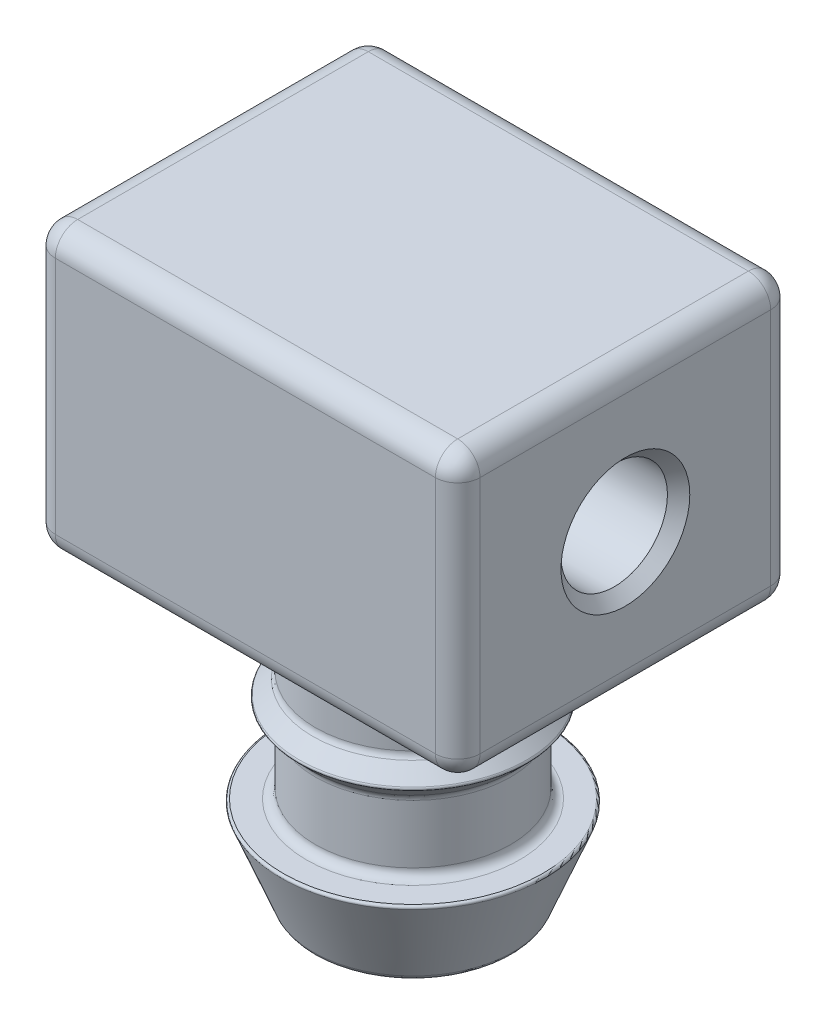
ISO-10303-21;
HEADER;
FILE_DESCRIPTION(('STEP AP214'),'2;1');
FILE_NAME('part.step','',(''),(''),'','','');
FILE_SCHEMA(('AUTOMOTIVE_DESIGN { 1 0 10303 214 1 1 1 1 }'));
ENDSEC;
DATA;
#1=APPLICATION_CONTEXT('core data for automotive mechanical design processes');
#2=APPLICATION_PROTOCOL_DEFINITION('international standard','automotive_design',2000,#1);
#3=PRODUCT_CONTEXT('',#1,'mechanical');
#4=PRODUCT('Part','Part','',(#3));
#5=PRODUCT_RELATED_PRODUCT_CATEGORY('part','',(#4));
#6=PRODUCT_DEFINITION_FORMATION('','',#4);
#7=PRODUCT_DEFINITION_CONTEXT('part definition',#1,'design');
#8=PRODUCT_DEFINITION('design','',#6,#7);
#9=PRODUCT_DEFINITION_SHAPE('','',#8);
#10=(LENGTH_UNIT() NAMED_UNIT(*) SI_UNIT(.MILLI.,.METRE.));
#11=(NAMED_UNIT(*) PLANE_ANGLE_UNIT() SI_UNIT($,.RADIAN.));
#12=(NAMED_UNIT(*) SI_UNIT($,.STERADIAN.) SOLID_ANGLE_UNIT());
#13=UNCERTAINTY_MEASURE_WITH_UNIT(LENGTH_MEASURE(1.E-05),#10,'distance_accuracy_value','');
#14=(GEOMETRIC_REPRESENTATION_CONTEXT(3) GLOBAL_UNCERTAINTY_ASSIGNED_CONTEXT((#13)) GLOBAL_UNIT_ASSIGNED_CONTEXT((#10,
#11,#12)) REPRESENTATION_CONTEXT('',''));
#15=CARTESIAN_POINT('',(0.,0.,0.));
#16=DIRECTION('',(0.,0.,1.));
#17=DIRECTION('',(1.,0.,0.));
#18=AXIS2_PLACEMENT_3D('',#15,#16,#17);
#19=CARTESIAN_POINT('',(0.,-4.7625,0.));
#20=DIRECTION('',(0.,1.,0.));
#21=DIRECTION('',(0.,0.,1.));
#22=AXIS2_PLACEMENT_3D('',#19,#20,#21);
#23=CONICAL_SURFACE('',#22,5.159375,0.785398163397442);
#24=CARTESIAN_POINT('',(0.,-4.83265825094585,0.));
#25=DIRECTION('',(0.,-1.,0.));
#26=DIRECTION('',(0.,0.,-1.));
#27=AXIS2_PLACEMENT_3D('',#24,#25,#26);
#28=CIRCLE('',#27,5.08921674905415);
#29=CARTESIAN_POINT('',(0.,-4.83265825094585,-5.08921674905415));
#30=VERTEX_POINT('',#29);
#31=EDGE_CURVE('E246',#30,#30,#28,.T.);
#32=ORIENTED_EDGE('',*,*,#31,.T.);
#33=EDGE_LOOP('',(#32));
#34=FACE_BOUND('',#33,.T.);
#35=CARTESIAN_POINT('',(0.,-5.44000800378342,0.));
#36=DIRECTION('',(0.,-1.,0.));
#37=DIRECTION('',(0.,0.,-1.));
#38=AXIS2_PLACEMENT_3D('',#35,#36,#37);
#39=CIRCLE('',#38,4.48186699621659);
#40=CARTESIAN_POINT('',(0.,-5.44000800378342,-4.48186699621659));
#41=VERTEX_POINT('',#40);
#42=EDGE_CURVE('E225',#41,#41,#39,.F.);
#43=ORIENTED_EDGE('',*,*,#42,.T.);
#44=EDGE_LOOP('',(#43));
#45=FACE_BOUND('',#44,.T.);
#46=ADVANCED_FACE('F36',(#34,#45),#23,.T.);
#47=CARTESIAN_POINT('',(0.,-3.96874999999999,0.));
#48=DIRECTION('',(0.,-1.,0.));
#49=DIRECTION('',(0.,0.,-1.));
#50=AXIS2_PLACEMENT_3D('',#47,#48,#49);
#51=CONICAL_SURFACE('',#50,4.365625,0.785398163397443);
#52=CARTESIAN_POINT('',(0.,-4.69234174905415,0.));
#53=DIRECTION('',(0.,1.,0.));
#54=DIRECTION('',(0.,0.,1.));
#55=AXIS2_PLACEMENT_3D('',#52,#53,#54);
#56=CIRCLE('',#55,5.08921674905415);
#57=CARTESIAN_POINT('',(0.,-4.69234174905415,5.08921674905415));
#58=VERTEX_POINT('',#57);
#59=EDGE_CURVE('E243',#58,#58,#56,.T.);
#60=ORIENTED_EDGE('',*,*,#59,.T.);
#61=EDGE_LOOP('',(#60));
#62=FACE_BOUND('',#61,.T.);
#63=CARTESIAN_POINT('',(0.,-4.08499199621658,0.));
#64=DIRECTION('',(0.,1.,0.));
#65=DIRECTION('',(0.,0.,1.));
#66=AXIS2_PLACEMENT_3D('',#63,#64,#65);
#67=CIRCLE('',#66,4.48186699621659);
#68=CARTESIAN_POINT('',(0.,-4.08499199621658,4.48186699621659));
#69=VERTEX_POINT('',#68);
#70=EDGE_CURVE('E222',#69,#69,#67,.F.);
#71=ORIENTED_EDGE('',*,*,#70,.T.);
#72=EDGE_LOOP('',(#71));
#73=FACE_BOUND('',#72,.T.);
#74=ADVANCED_FACE('F403',(#62,#73),#51,.T.);
#75=CARTESIAN_POINT('',(0.,7.73770022883319,0.));
#76=DIRECTION('',(0.,1.,0.));
#77=DIRECTION('',(0.,0.,1.));
#78=AXIS2_PLACEMENT_3D('',#75,#76,#77);
#79=CYLINDRICAL_SURFACE('',#78,4.365625);
#80=CARTESIAN_POINT('',(0.,-5.72064100756683,0.));
#81=DIRECTION('',(0.,1.,0.));
#82=DIRECTION('',(0.,0.,1.));
#83=AXIS2_PLACEMENT_3D('',#80,#81,#82);
#84=CIRCLE('',#83,4.365625);
#85=CARTESIAN_POINT('',(0.,-5.72064100756683,4.365625));
#86=VERTEX_POINT('',#85);
#87=EDGE_CURVE('E231',#86,#86,#84,.F.);
#88=ORIENTED_EDGE('',*,*,#87,.T.);
#89=EDGE_LOOP('',(#88));
#90=FACE_BOUND('',#89,.T.);
#91=CARTESIAN_POINT('',(0.,-8.334375,0.));
#92=DIRECTION('',(0.,-1.,0.));
#93=DIRECTION('',(0.,0.,-1.));
#94=AXIS2_PLACEMENT_3D('',#91,#92,#93);
#95=CIRCLE('',#94,4.365625);
#96=CARTESIAN_POINT('',(0.,-8.334375,-4.365625));
#97=VERTEX_POINT('',#96);
#98=EDGE_CURVE('E228',#97,#97,#95,.F.);
#99=ORIENTED_EDGE('',*,*,#98,.T.);
#100=EDGE_LOOP('',(#99));
#101=FACE_BOUND('',#100,.T.);
#102=ADVANCED_FACE('F411',(#90,#101),#79,.T.);
#103=CARTESIAN_POINT('',(0.,-8.73125,0.));
#104=DIRECTION('',(0.,-1.,0.));
#105=DIRECTION('',(0.,0.,-1.));
#106=AXIS2_PLACEMENT_3D('',#103,#104,#105);
#107=PLANE('',#106);
#108=CARTESIAN_POINT('',(0.,-8.73125,0.));
#109=DIRECTION('',(0.,-1.,0.));
#110=DIRECTION('',(0.,0.,-1.));
#111=AXIS2_PLACEMENT_3D('',#108,#109,#110);
#112=CIRCLE('',#111,5.80657563585843);
#113=CARTESIAN_POINT('',(0.,-8.73125,-5.80657563585843));
#114=VERTEX_POINT('',#113);
#115=EDGE_CURVE('E249',#114,#114,#112,.F.);
#116=ORIENTED_EDGE('',*,*,#115,.T.);
#117=EDGE_LOOP('',(#116));
#118=FACE_BOUND('',#117,.T.);
#119=CARTESIAN_POINT('',(0.,-8.73125,0.));
#120=DIRECTION('',(0.,-1.,0.));
#121=DIRECTION('',(0.,0.,-1.));
#122=AXIS2_PLACEMENT_3D('',#119,#120,#121);
#123=CIRCLE('',#122,4.7625);
#124=CARTESIAN_POINT('',(0.,-8.73125,-4.7625));
#125=VERTEX_POINT('',#124);
#126=EDGE_CURVE('E240',#125,#125,#123,.T.);
#127=ORIENTED_EDGE('',*,*,#126,.T.);
#128=EDGE_LOOP('',(#127));
#129=FACE_BOUND('',#128,.T.);
#130=ADVANCED_FACE('F726',(#118,#129),#107,.F.);
#131=CARTESIAN_POINT('',(0.,-12.7,0.));
#132=DIRECTION('',(0.,1.,0.));
#133=DIRECTION('',(0.,0.,1.));
#134=AXIS2_PLACEMENT_3D('',#131,#132,#133);
#135=CONICAL_SURFACE('',#134,4.365625,0.380506377112365);
#136=CARTESIAN_POINT('',(0.,-8.86731766866951,0.));
#137=DIRECTION('',(0.,-1.,0.));
#138=DIRECTION('',(0.,0.,-1.));
#139=AXIS2_PLACEMENT_3D('',#136,#137,#138);
#140=CIRCLE('',#139,5.8986979325322);
#141=CARTESIAN_POINT('',(0.,-8.86731766866951,-5.8986979325322));
#142=VERTEX_POINT('',#141);
#143=EDGE_CURVE('E252',#142,#142,#140,.T.);
#144=ORIENTED_EDGE('',*,*,#143,.T.);
#145=EDGE_LOOP('',(#144));
#146=FACE_BOUND('',#145,.T.);
#147=CARTESIAN_POINT('',(0.,-12.450520674678,0.));
#148=DIRECTION('',(0.,-1.,0.));
#149=DIRECTION('',(0.,0.,-1.));
#150=AXIS2_PLACEMENT_3D('',#147,#148,#149);
#151=CIRCLE('',#150,4.46541673012879);
#152=CARTESIAN_POINT('',(0.,-12.450520674678,-4.46541673012879));
#153=VERTEX_POINT('',#152);
#154=EDGE_CURVE('E234',#153,#153,#151,.F.);
#155=ORIENTED_EDGE('',*,*,#154,.T.);
#156=EDGE_LOOP('',(#155));
#157=FACE_BOUND('',#156,.T.);
#158=ADVANCED_FACE('F404',(#146,#157),#135,.T.);
#159=CARTESIAN_POINT('',(0.,-12.7,0.));
#160=DIRECTION('',(0.,1.,0.));
#161=DIRECTION('',(0.,0.,1.));
#162=AXIS2_PLACEMENT_3D('',#159,#160,#161);
#163=PLANE('',#162);
#164=CARTESIAN_POINT('',(0.,-12.7,0.));
#165=DIRECTION('',(0.,1.,0.));
#166=DIRECTION('',(0.,0.,1.));
#167=AXIS2_PLACEMENT_3D('',#164,#165,#166);
#168=CIRCLE('',#167,4.0969275434337);
#169=CARTESIAN_POINT('',(0.,-12.7,4.0969275434337));
#170=VERTEX_POINT('',#169);
#171=EDGE_CURVE('E237',#170,#170,#168,.F.);
#172=ORIENTED_EDGE('',*,*,#171,.T.);
#173=EDGE_LOOP('',(#172));
#174=FACE_BOUND('',#173,.T.);
#175=ADVANCED_FACE('F395',(#174),#163,.F.);
#176=CARTESIAN_POINT('',(0.,0.,0.));
#177=DIRECTION('',(0.,1.,0.));
#178=DIRECTION('',(0.,0.,1.));
#179=AXIS2_PLACEMENT_3D('',#176,#177,#178);
#180=PLANE('',#179);
#181=DIRECTION('',(0.,0.,1.));
#182=VECTOR('',#181,1.);
#183=CARTESIAN_POINT('',(-8.5,0.,-7.5));
#184=LINE('',#183,#182);
#185=CARTESIAN_POINT('',(-8.5,0.,6.5));
#186=VERTEX_POINT('',#185);
#187=CARTESIAN_POINT('',(-8.5,0.,-6.5));
#188=VERTEX_POINT('',#187);
#189=EDGE_CURVE('E59',#186,#188,#184,.F.);
#190=ORIENTED_EDGE('',*,*,#189,.T.);
#191=DIRECTION('',(-1.,0.,0.));
#192=VECTOR('',#191,1.);
#193=CARTESIAN_POINT('',(9.5,0.,-6.5));
#194=LINE('',#193,#192);
#195=CARTESIAN_POINT('',(8.5,0.,-6.5));
#196=VERTEX_POINT('',#195);
#197=EDGE_CURVE('E11',#188,#196,#194,.F.);
#198=ORIENTED_EDGE('',*,*,#197,.T.);
#199=DIRECTION('',(0.,0.,-1.));
#200=VECTOR('',#199,1.);
#201=CARTESIAN_POINT('',(8.5,0.,7.5));
#202=LINE('',#201,#200);
#203=CARTESIAN_POINT('',(8.5,0.,6.5));
#204=VERTEX_POINT('',#203);
#205=EDGE_CURVE('E45',#196,#204,#202,.F.);
#206=ORIENTED_EDGE('',*,*,#205,.T.);
#207=DIRECTION('',(1.,0.,0.));
#208=VECTOR('',#207,1.);
#209=CARTESIAN_POINT('',(-9.5,0.,6.5));
#210=LINE('',#209,#208);
#211=EDGE_CURVE('E302',#204,#186,#210,.F.);
#212=ORIENTED_EDGE('',*,*,#211,.T.);
#213=EDGE_LOOP('',(#190,#198,#206,#212));
#214=FACE_BOUND('',#213,.T.);
#215=CARTESIAN_POINT('',(0.,0.,0.));
#216=DIRECTION('',(0.,1.,0.));
#217=DIRECTION('',(0.,0.,1.));
#218=AXIS2_PLACEMENT_3D('',#215,#216,#217);
#219=CIRCLE('',#218,4.7625);
#220=CARTESIAN_POINT('',(0.,0.,4.7625));
#221=VERTEX_POINT('',#220);
#222=EDGE_CURVE('E206',#221,#221,#219,.T.);
#223=ORIENTED_EDGE('',*,*,#222,.T.);
#224=EDGE_LOOP('',(#223));
#225=FACE_BOUND('',#224,.T.);
#226=ADVANCED_FACE('F392',(#214,#225),#180,.F.);
#227=CARTESIAN_POINT('',(0.,7.73770022883319,0.));
#228=DIRECTION('',(0.,1.,0.));
#229=DIRECTION('',(0.,0.,1.));
#230=AXIS2_PLACEMENT_3D('',#227,#228,#229);
#231=CYLINDRICAL_SURFACE('',#230,4.365625);
#232=CARTESIAN_POINT('',(0.,-0.396875000000001,0.));
#233=DIRECTION('',(0.,1.,0.));
#234=DIRECTION('',(0.,0.,1.));
#235=AXIS2_PLACEMENT_3D('',#232,#233,#234);
#236=CIRCLE('',#235,4.365625);
#237=CARTESIAN_POINT('',(0.,-0.396875000000001,4.365625));
#238=VERTEX_POINT('',#237);
#239=EDGE_CURVE('E217',#238,#238,#236,.F.);
#240=ORIENTED_EDGE('',*,*,#239,.T.);
#241=EDGE_LOOP('',(#240));
#242=FACE_BOUND('',#241,.T.);
#243=CARTESIAN_POINT('',(0.,-3.80435899243317,0.));
#244=DIRECTION('',(0.,1.,0.));
#245=DIRECTION('',(0.,0.,1.));
#246=AXIS2_PLACEMENT_3D('',#243,#244,#245);
#247=CIRCLE('',#246,4.365625);
#248=CARTESIAN_POINT('',(0.,-3.80435899243317,4.365625));
#249=VERTEX_POINT('',#248);
#250=EDGE_CURVE('E212',#249,#249,#247,.T.);
#251=ORIENTED_EDGE('',*,*,#250,.T.);
#252=EDGE_LOOP('',(#251));
#253=FACE_BOUND('',#252,.T.);
#254=ADVANCED_FACE('F394',(#242,#253),#231,.T.);
#255=CARTESIAN_POINT('',(9.5,0.,7.5));
#256=DIRECTION('',(1.,0.,0.));
#257=DIRECTION('',(0.,0.,-1.));
#258=AXIS2_PLACEMENT_3D('',#255,#256,#257);
#259=PLANE('',#258);
#260=DIRECTION('',(0.,1.,0.));
#261=VECTOR('',#260,1.);
#262=CARTESIAN_POINT('',(9.5,0.,-6.5));
#263=LINE('',#262,#261);
#264=CARTESIAN_POINT('',(9.5,1.,-6.5));
#265=VERTEX_POINT('',#264);
#266=CARTESIAN_POINT('',(9.5,11.7,-6.5));
#267=VERTEX_POINT('',#266);
#268=EDGE_CURVE('E290',#265,#267,#263,.T.);
#269=ORIENTED_EDGE('',*,*,#268,.T.);
#270=DIRECTION('',(0.,0.,-1.));
#271=VECTOR('',#270,1.);
#272=CARTESIAN_POINT('',(9.5,11.7,7.5));
#273=LINE('',#272,#271);
#274=CARTESIAN_POINT('',(9.5,11.7,6.5));
#275=VERTEX_POINT('',#274);
#276=EDGE_CURVE('E160',#267,#275,#273,.F.);
#277=ORIENTED_EDGE('',*,*,#276,.T.);
#278=DIRECTION('',(0.,1.,0.));
#279=VECTOR('',#278,1.);
#280=CARTESIAN_POINT('',(9.5,0.,6.5));
#281=LINE('',#280,#279);
#282=CARTESIAN_POINT('',(9.5,1.,6.5));
#283=VERTEX_POINT('',#282);
#284=EDGE_CURVE('E286',#275,#283,#281,.F.);
#285=ORIENTED_EDGE('',*,*,#284,.T.);
#286=DIRECTION('',(0.,0.,-1.));
#287=VECTOR('',#286,1.);
#288=CARTESIAN_POINT('',(9.5,1.,-7.5));
#289=LINE('',#288,#287);
#290=EDGE_CURVE('E288',#283,#265,#289,.T.);
#291=ORIENTED_EDGE('',*,*,#290,.T.);
#292=EDGE_LOOP('',(#269,#277,#285,#291));
#293=FACE_BOUND('',#292,.T.);
#294=CARTESIAN_POINT('',(9.5,6.35,0.));
#295=DIRECTION('',(1.,0.,0.));
#296=DIRECTION('',(0.,0.,-1.));
#297=AXIS2_PLACEMENT_3D('',#294,#295,#296);
#298=CIRCLE('',#297,2.88125);
#299=CARTESIAN_POINT('',(9.5,6.35,-2.88125));
#300=VERTEX_POINT('',#299);
#301=EDGE_CURVE('E261',#300,#300,#298,.F.);
#302=ORIENTED_EDGE('',*,*,#301,.T.);
#303=EDGE_LOOP('',(#302));
#304=FACE_BOUND('',#303,.T.);
#305=ADVANCED_FACE('F345',(#293,#304),#259,.T.);
#306=CARTESIAN_POINT('',(-9.5,0.,7.5));
#307=DIRECTION('',(0.,0.,1.));
#308=DIRECTION('',(1.,0.,0.));
#309=AXIS2_PLACEMENT_3D('',#306,#307,#308);
#310=PLANE('',#309);
#311=DIRECTION('',(0.,1.,0.));
#312=VECTOR('',#311,1.);
#313=CARTESIAN_POINT('',(8.50000000000001,0.,7.5));
#314=LINE('',#313,#312);
#315=CARTESIAN_POINT('',(8.50000000000001,1.,7.5));
#316=VERTEX_POINT('',#315);
#317=CARTESIAN_POINT('',(8.50000000000001,11.7,7.5));
#318=VERTEX_POINT('',#317);
#319=EDGE_CURVE('E268',#316,#318,#314,.T.);
#320=ORIENTED_EDGE('',*,*,#319,.T.);
#321=DIRECTION('',(1.,0.,0.));
#322=VECTOR('',#321,1.);
#323=CARTESIAN_POINT('',(-9.5,11.7,7.5));
#324=LINE('',#323,#322);
#325=CARTESIAN_POINT('',(-8.5,11.7,7.5));
#326=VERTEX_POINT('',#325);
#327=EDGE_CURVE('E274',#318,#326,#324,.F.);
#328=ORIENTED_EDGE('',*,*,#327,.T.);
#329=DIRECTION('',(0.,1.,0.));
#330=VECTOR('',#329,1.);
#331=CARTESIAN_POINT('',(-8.5,0.,7.5));
#332=LINE('',#331,#330);
#333=CARTESIAN_POINT('',(-8.5,1.,7.5));
#334=VERTEX_POINT('',#333);
#335=EDGE_CURVE('E272',#326,#334,#332,.F.);
#336=ORIENTED_EDGE('',*,*,#335,.T.);
#337=DIRECTION('',(1.,0.,0.));
#338=VECTOR('',#337,1.);
#339=CARTESIAN_POINT('',(9.5,1.,7.5));
#340=LINE('',#339,#338);
#341=EDGE_CURVE('E270',#334,#316,#340,.T.);
#342=ORIENTED_EDGE('',*,*,#341,.T.);
#343=EDGE_LOOP('',(#320,#328,#336,#342));
#344=FACE_BOUND('',#343,.T.);
#345=ADVANCED_FACE('F331',(#344),#310,.T.);
#346=CARTESIAN_POINT('',(-9.5,0.,7.5));
#347=DIRECTION('',(-1.,0.,0.));
#348=DIRECTION('',(0.,0.,1.));
#349=AXIS2_PLACEMENT_3D('',#346,#347,#348);
#350=PLANE('',#349);
#351=DIRECTION('',(0.,1.,0.));
#352=VECTOR('',#351,1.);
#353=CARTESIAN_POINT('',(-9.5,0.,6.5));
#354=LINE('',#353,#352);
#355=CARTESIAN_POINT('',(-9.5,1.,6.5));
#356=VERTEX_POINT('',#355);
#357=CARTESIAN_POINT('',(-9.5,11.7,6.5));
#358=VERTEX_POINT('',#357);
#359=EDGE_CURVE('E277',#356,#358,#354,.T.);
#360=ORIENTED_EDGE('',*,*,#359,.T.);
#361=DIRECTION('',(0.,0.,1.));
#362=VECTOR('',#361,1.);
#363=CARTESIAN_POINT('',(-9.5,11.7,-7.5));
#364=LINE('',#363,#362);
#365=CARTESIAN_POINT('',(-9.5,11.7,-6.5));
#366=VERTEX_POINT('',#365);
#367=EDGE_CURVE('E283',#358,#366,#364,.F.);
#368=ORIENTED_EDGE('',*,*,#367,.T.);
#369=DIRECTION('',(0.,1.,0.));
#370=VECTOR('',#369,1.);
#371=CARTESIAN_POINT('',(-9.5,0.,-6.5));
#372=LINE('',#371,#370);
#373=CARTESIAN_POINT('',(-9.5,1.,-6.5));
#374=VERTEX_POINT('',#373);
#375=EDGE_CURVE('E281',#366,#374,#372,.F.);
#376=ORIENTED_EDGE('',*,*,#375,.T.);
#377=DIRECTION('',(0.,0.,1.));
#378=VECTOR('',#377,1.);
#379=CARTESIAN_POINT('',(-9.5,1.,7.5));
#380=LINE('',#379,#378);
#381=EDGE_CURVE('E279',#374,#356,#380,.T.);
#382=ORIENTED_EDGE('',*,*,#381,.T.);
#383=EDGE_LOOP('',(#360,#368,#376,#382));
#384=FACE_BOUND('',#383,.T.);
#385=CARTESIAN_POINT('',(-9.5,6.35,0.));
#386=DIRECTION('',(-1.,0.,0.));
#387=DIRECTION('',(0.,0.,1.));
#388=AXIS2_PLACEMENT_3D('',#385,#386,#387);
#389=CIRCLE('',#388,2.88125);
#390=CARTESIAN_POINT('',(-9.5,6.35,2.88125));
#391=VERTEX_POINT('',#390);
#392=EDGE_CURVE('E148',#391,#391,#389,.F.);
#393=ORIENTED_EDGE('',*,*,#392,.T.);
#394=EDGE_LOOP('',(#393));
#395=FACE_BOUND('',#394,.T.);
#396=ADVANCED_FACE('F369',(#384,#395),#350,.T.);
#397=CARTESIAN_POINT('',(-9.5,0.,-7.5));
#398=DIRECTION('',(0.,0.,-1.));
#399=DIRECTION('',(-1.,0.,0.));
#400=AXIS2_PLACEMENT_3D('',#397,#398,#399);
#401=PLANE('',#400);
#402=DIRECTION('',(-1.,0.,0.));
#403=VECTOR('',#402,1.);
#404=CARTESIAN_POINT('',(-9.5,1.,-7.5));
#405=LINE('',#404,#403);
#406=CARTESIAN_POINT('',(8.5,1.,-7.5));
#407=VERTEX_POINT('',#406);
#408=CARTESIAN_POINT('',(-8.5,1.,-7.5));
#409=VERTEX_POINT('',#408);
#410=EDGE_CURVE('E297',#407,#409,#405,.T.);
#411=ORIENTED_EDGE('',*,*,#410,.T.);
#412=DIRECTION('',(0.,1.,0.));
#413=VECTOR('',#412,1.);
#414=CARTESIAN_POINT('',(-8.5,0.,-7.5));
#415=LINE('',#414,#413);
#416=CARTESIAN_POINT('',(-8.5,11.7,-7.5));
#417=VERTEX_POINT('',#416);
#418=EDGE_CURVE('E299',#409,#417,#415,.T.);
#419=ORIENTED_EDGE('',*,*,#418,.T.);
#420=DIRECTION('',(-1.,0.,0.));
#421=VECTOR('',#420,1.);
#422=CARTESIAN_POINT('',(9.5,11.7,-7.5));
#423=LINE('',#422,#421);
#424=CARTESIAN_POINT('',(8.5,11.7,-7.5));
#425=VERTEX_POINT('',#424);
#426=EDGE_CURVE('E293',#417,#425,#423,.F.);
#427=ORIENTED_EDGE('',*,*,#426,.T.);
#428=DIRECTION('',(0.,1.,0.));
#429=VECTOR('',#428,1.);
#430=CARTESIAN_POINT('',(8.50000000000001,0.,-7.5));
#431=LINE('',#430,#429);
#432=EDGE_CURVE('E295',#425,#407,#431,.F.);
#433=ORIENTED_EDGE('',*,*,#432,.T.);
#434=EDGE_LOOP('',(#411,#419,#427,#433));
#435=FACE_BOUND('',#434,.T.);
#436=ADVANCED_FACE('F353',(#435),#401,.T.);
#437=CARTESIAN_POINT('',(0.,12.7,0.));
#438=DIRECTION('',(0.,-1.,0.));
#439=DIRECTION('',(0.,0.,-1.));
#440=AXIS2_PLACEMENT_3D('',#437,#438,#439);
#441=PLANE('',#440);
#442=DIRECTION('',(0.,0.,1.));
#443=VECTOR('',#442,1.);
#444=CARTESIAN_POINT('',(-8.5,12.7,7.5));
#445=LINE('',#444,#443);
#446=CARTESIAN_POINT('',(-8.5,12.7,-6.5));
#447=VERTEX_POINT('',#446);
#448=CARTESIAN_POINT('',(-8.5,12.7,6.5));
#449=VERTEX_POINT('',#448);
#450=EDGE_CURVE('E137',#447,#449,#445,.T.);
#451=ORIENTED_EDGE('',*,*,#450,.T.);
#452=DIRECTION('',(1.,0.,0.));
#453=VECTOR('',#452,1.);
#454=CARTESIAN_POINT('',(9.5,12.7,6.5));
#455=LINE('',#454,#453);
#456=CARTESIAN_POINT('',(8.5,12.7,6.5));
#457=VERTEX_POINT('',#456);
#458=EDGE_CURVE('E133',#449,#457,#455,.T.);
#459=ORIENTED_EDGE('',*,*,#458,.T.);
#460=DIRECTION('',(0.,0.,-1.));
#461=VECTOR('',#460,1.);
#462=CARTESIAN_POINT('',(8.5,12.7,-7.5));
#463=LINE('',#462,#461);
#464=CARTESIAN_POINT('',(8.5,12.7,-6.5));
#465=VERTEX_POINT('',#464);
#466=EDGE_CURVE('E127',#457,#465,#463,.T.);
#467=ORIENTED_EDGE('',*,*,#466,.T.);
#468=DIRECTION('',(-1.,0.,0.));
#469=VECTOR('',#468,1.);
#470=CARTESIAN_POINT('',(-9.5,12.7,-6.5));
#471=LINE('',#470,#469);
#472=EDGE_CURVE('E130',#465,#447,#471,.T.);
#473=ORIENTED_EDGE('',*,*,#472,.T.);
#474=EDGE_LOOP('',(#451,#459,#467,#473));
#475=FACE_BOUND('',#474,.T.);
#476=ADVANCED_FACE('F129',(#475),#441,.F.);
#477=CARTESIAN_POINT('',(-9.5,6.35,0.));
#478=DIRECTION('',(1.,0.,0.));
#479=DIRECTION('',(0.,0.,-1.));
#480=AXIS2_PLACEMENT_3D('',#477,#478,#479);
#481=CYLINDRICAL_SURFACE('',#480,2.38125);
#482=CARTESIAN_POINT('',(9.00000000000001,6.35,0.));
#483=DIRECTION('',(1.,0.,0.));
#484=DIRECTION('',(0.,0.,-1.));
#485=AXIS2_PLACEMENT_3D('',#482,#483,#484);
#486=CIRCLE('',#485,2.38125);
#487=CARTESIAN_POINT('',(9.00000000000001,6.35,-2.38125));
#488=VERTEX_POINT('',#487);
#489=EDGE_CURVE('E258',#488,#488,#486,.T.);
#490=ORIENTED_EDGE('',*,*,#489,.T.);
#491=EDGE_LOOP('',(#490));
#492=FACE_BOUND('',#491,.T.);
#493=CARTESIAN_POINT('',(-9.,6.35,0.));
#494=DIRECTION('',(-1.,0.,0.));
#495=DIRECTION('',(0.,0.,1.));
#496=AXIS2_PLACEMENT_3D('',#493,#494,#495);
#497=CIRCLE('',#496,2.38125);
#498=CARTESIAN_POINT('',(-9.,6.35,2.38125));
#499=VERTEX_POINT('',#498);
#500=EDGE_CURVE('E255',#499,#499,#497,.T.);
#501=ORIENTED_EDGE('',*,*,#500,.T.);
#502=EDGE_LOOP('',(#501));
#503=FACE_BOUND('',#502,.T.);
#504=ADVANCED_FACE('F417',(#492,#503),#481,.F.);
#505=CARTESIAN_POINT('',(0.,-0.396875000000001,0.));
#506=DIRECTION('',(0.,1.,0.));
#507=DIRECTION('',(0.,0.,1.));
#508=AXIS2_PLACEMENT_3D('',#505,#506,#507);
#509=TOROIDAL_SURFACE('',#508,4.7625,0.396875);
#510=ORIENTED_EDGE('',*,*,#239,.F.);
#511=EDGE_LOOP('',(#510));
#512=FACE_BOUND('',#511,.T.);
#513=ORIENTED_EDGE('',*,*,#222,.F.);
#514=EDGE_LOOP('',(#513));
#515=FACE_BOUND('',#514,.T.);
#516=ADVANCED_FACE('F413',(#512,#515),#509,.F.);
#517=CARTESIAN_POINT('',(0.,-3.80435899243317,0.));
#518=DIRECTION('',(0.,1.,0.));
#519=DIRECTION('',(0.,0.,1.));
#520=AXIS2_PLACEMENT_3D('',#517,#518,#519);
#521=TOROIDAL_SURFACE('',#520,4.7625,0.396875);
#522=ORIENTED_EDGE('',*,*,#70,.F.);
#523=EDGE_LOOP('',(#522));
#524=FACE_BOUND('',#523,.T.);
#525=ORIENTED_EDGE('',*,*,#250,.F.);
#526=EDGE_LOOP('',(#525));
#527=FACE_BOUND('',#526,.T.);
#528=ADVANCED_FACE('F416',(#524,#527),#521,.F.);
#529=CARTESIAN_POINT('',(0.,-5.72064100756683,0.));
#530=DIRECTION('',(0.,1.,0.));
#531=DIRECTION('',(0.,0.,1.));
#532=AXIS2_PLACEMENT_3D('',#529,#530,#531);
#533=TOROIDAL_SURFACE('',#532,4.7625,0.396875);
#534=ORIENTED_EDGE('',*,*,#87,.F.);
#535=EDGE_LOOP('',(#534));
#536=FACE_BOUND('',#535,.T.);
#537=ORIENTED_EDGE('',*,*,#42,.F.);
#538=EDGE_LOOP('',(#537));
#539=FACE_BOUND('',#538,.T.);
#540=ADVANCED_FACE('F421',(#536,#539),#533,.F.);
#541=CARTESIAN_POINT('',(0.,-12.303125,0.));
#542=DIRECTION('',(0.,1.,0.));
#543=DIRECTION('',(0.,0.,1.));
#544=AXIS2_PLACEMENT_3D('',#541,#542,#543);
#545=TOROIDAL_SURFACE('',#544,4.0969275434337,0.396875);
#546=ORIENTED_EDGE('',*,*,#171,.F.);
#547=EDGE_LOOP('',(#546));
#548=FACE_BOUND('',#547,.T.);
#549=ORIENTED_EDGE('',*,*,#154,.F.);
#550=EDGE_LOOP('',(#549));
#551=FACE_BOUND('',#550,.T.);
#552=ADVANCED_FACE('F425',(#548,#551),#545,.T.);
#553=CARTESIAN_POINT('',(0.,-8.334375,0.));
#554=DIRECTION('',(0.,-1.,0.));
#555=DIRECTION('',(0.,0.,-1.));
#556=AXIS2_PLACEMENT_3D('',#553,#554,#555);
#557=TOROIDAL_SURFACE('',#556,4.7625,0.396875);
#558=ORIENTED_EDGE('',*,*,#126,.F.);
#559=EDGE_LOOP('',(#558));
#560=FACE_BOUND('',#559,.T.);
#561=ORIENTED_EDGE('',*,*,#98,.F.);
#562=EDGE_LOOP('',(#561));
#563=FACE_BOUND('',#562,.T.);
#564=ADVANCED_FACE('F429',(#560,#563),#557,.F.);
#565=CARTESIAN_POINT('',(0.,-4.7625,0.));
#566=DIRECTION('',(0.,-1.,0.));
#567=DIRECTION('',(0.,0.,-1.));
#568=AXIS2_PLACEMENT_3D('',#565,#566,#567);
#569=TOROIDAL_SURFACE('',#568,5.0190584981083,0.09921875);
#570=ORIENTED_EDGE('',*,*,#31,.F.);
#571=EDGE_LOOP('',(#570));
#572=FACE_BOUND('',#571,.T.);
#573=ORIENTED_EDGE('',*,*,#59,.F.);
#574=EDGE_LOOP('',(#573));
#575=FACE_BOUND('',#574,.T.);
#576=ADVANCED_FACE('F433',(#572,#575),#569,.T.);
#577=CARTESIAN_POINT('',(0.,-8.83046875,0.));
#578=DIRECTION('',(0.,-1.,0.));
#579=DIRECTION('',(0.,0.,-1.));
#580=AXIS2_PLACEMENT_3D('',#577,#578,#579);
#581=TOROIDAL_SURFACE('',#580,5.80657563585843,0.09921875);
#582=ORIENTED_EDGE('',*,*,#143,.F.);
#583=EDGE_LOOP('',(#582));
#584=FACE_BOUND('',#583,.T.);
#585=ORIENTED_EDGE('',*,*,#115,.F.);
#586=EDGE_LOOP('',(#585));
#587=FACE_BOUND('',#586,.T.);
#588=ADVANCED_FACE('F437',(#584,#587),#581,.T.);
#589=CARTESIAN_POINT('',(9.00000000000001,6.35,0.));
#590=DIRECTION('',(1.,0.,0.));
#591=DIRECTION('',(0.,0.,-1.));
#592=AXIS2_PLACEMENT_3D('',#589,#590,#591);
#593=CONICAL_SURFACE('',#592,2.38125,0.785398163397453);
#594=ORIENTED_EDGE('',*,*,#301,.F.);
#595=EDGE_LOOP('',(#594));
#596=FACE_BOUND('',#595,.T.);
#597=ORIENTED_EDGE('',*,*,#489,.F.);
#598=EDGE_LOOP('',(#597));
#599=FACE_BOUND('',#598,.T.);
#600=ADVANCED_FACE('F441',(#596,#599),#593,.F.);
#601=CARTESIAN_POINT('',(-9.5,6.35,0.));
#602=DIRECTION('',(-1.,0.,0.));
#603=DIRECTION('',(0.,0.,1.));
#604=AXIS2_PLACEMENT_3D('',#601,#602,#603);
#605=CONICAL_SURFACE('',#604,2.88125,0.785398163397446);
#606=ORIENTED_EDGE('',*,*,#500,.F.);
#607=EDGE_LOOP('',(#606));
#608=FACE_BOUND('',#607,.T.);
#609=ORIENTED_EDGE('',*,*,#392,.F.);
#610=EDGE_LOOP('',(#609));
#611=FACE_BOUND('',#610,.T.);
#612=ADVANCED_FACE('F449',(#608,#611),#605,.F.);
#613=CARTESIAN_POINT('',(-9.5,1.,-6.5));
#614=DIRECTION('',(1.,0.,0.));
#615=DIRECTION('',(0.,0.,-1.));
#616=AXIS2_PLACEMENT_3D('',#613,#614,#615);
#617=CYLINDRICAL_SURFACE('',#616,1.);
#618=CARTESIAN_POINT('',(-8.5,1.,-6.5));
#619=DIRECTION('',(-1.,0.,0.));
#620=DIRECTION('',(0.,0.,1.));
#621=AXIS2_PLACEMENT_3D('',#618,#619,#620);
#622=CIRCLE('',#621,1.);
#623=EDGE_CURVE('E40',#409,#188,#622,.T.);
#624=ORIENTED_EDGE('',*,*,#623,.F.);
#625=ORIENTED_EDGE('',*,*,#410,.F.);
#626=CARTESIAN_POINT('',(8.5,1.,-6.5));
#627=DIRECTION('',(1.,0.,0.));
#628=DIRECTION('',(0.,0.,-1.));
#629=AXIS2_PLACEMENT_3D('',#626,#627,#628);
#630=CIRCLE('',#629,1.);
#631=EDGE_CURVE('E200',#196,#407,#630,.T.);
#632=ORIENTED_EDGE('',*,*,#631,.F.);
#633=ORIENTED_EDGE('',*,*,#197,.F.);
#634=EDGE_LOOP('',(#624,#625,#632,#633));
#635=FACE_BOUND('',#634,.T.);
#636=ADVANCED_FACE('F38',(#635),#617,.T.);
#637=CARTESIAN_POINT('',(-8.5,1.,-6.5));
#638=DIRECTION('',(0.,-1.,0.));
#639=DIRECTION('',(0.,0.,-1.));
#640=AXIS2_PLACEMENT_3D('',#637,#638,#639);
#641=SPHERICAL_SURFACE('',#640,1.);
#642=CARTESIAN_POINT('',(-8.5,1.,-6.5));
#643=DIRECTION('',(0.,-1.,0.));
#644=DIRECTION('',(0.,0.,-1.));
#645=AXIS2_PLACEMENT_3D('',#642,#643,#644);
#646=CIRCLE('',#645,1.);
#647=EDGE_CURVE('E195',#409,#374,#646,.F.);
#648=ORIENTED_EDGE('',*,*,#647,.F.);
#649=ORIENTED_EDGE('',*,*,#623,.T.);
#650=CARTESIAN_POINT('',(-8.5,1.,-6.5));
#651=DIRECTION('',(0.,0.,-1.));
#652=DIRECTION('',(-1.,0.,0.));
#653=AXIS2_PLACEMENT_3D('',#650,#651,#652);
#654=CIRCLE('',#653,1.);
#655=EDGE_CURVE('E198',#374,#188,#654,.F.);
#656=ORIENTED_EDGE('',*,*,#655,.F.);
#657=EDGE_LOOP('',(#648,#649,#656));
#658=FACE_BOUND('',#657,.T.);
#659=ADVANCED_FACE('F356',(#658),#641,.T.);
#660=CARTESIAN_POINT('',(8.5,1.,-6.5));
#661=DIRECTION('',(0.,0.,-1.));
#662=DIRECTION('',(-1.,0.,0.));
#663=AXIS2_PLACEMENT_3D('',#660,#661,#662);
#664=SPHERICAL_SURFACE('',#663,1.);
#665=CARTESIAN_POINT('',(8.5,1.,-6.5));
#666=DIRECTION('',(0.,0.,-1.));
#667=DIRECTION('',(0.,1.,0.));
#668=AXIS2_PLACEMENT_3D('',#665,#666,#667);
#669=CIRCLE('',#668,1.);
#670=EDGE_CURVE('E190',#196,#265,#669,.F.);
#671=ORIENTED_EDGE('',*,*,#670,.F.);
#672=ORIENTED_EDGE('',*,*,#631,.T.);
#673=CARTESIAN_POINT('',(8.5,1.,-6.5));
#674=DIRECTION('',(0.,-1.,0.));
#675=DIRECTION('',(0.,0.,-1.));
#676=AXIS2_PLACEMENT_3D('',#673,#674,#675);
#677=CIRCLE('',#676,1.);
#678=EDGE_CURVE('E192',#265,#407,#677,.F.);
#679=ORIENTED_EDGE('',*,*,#678,.F.);
#680=EDGE_LOOP('',(#671,#672,#679));
#681=FACE_BOUND('',#680,.T.);
#682=ADVANCED_FACE('F384',(#681),#664,.T.);
#683=CARTESIAN_POINT('',(-8.5,1.,7.5));
#684=DIRECTION('',(0.,0.,-1.));
#685=DIRECTION('',(-1.,0.,0.));
#686=AXIS2_PLACEMENT_3D('',#683,#684,#685);
#687=CYLINDRICAL_SURFACE('',#686,1.);
#688=ORIENTED_EDGE('',*,*,#655,.T.);
#689=ORIENTED_EDGE('',*,*,#189,.F.);
#690=CARTESIAN_POINT('',(-8.5,1.,6.5));
#691=DIRECTION('',(0.,0.,1.));
#692=DIRECTION('',(1.,0.,0.));
#693=AXIS2_PLACEMENT_3D('',#690,#691,#692);
#694=CIRCLE('',#693,1.);
#695=EDGE_CURVE('E184',#356,#186,#694,.T.);
#696=ORIENTED_EDGE('',*,*,#695,.F.);
#697=ORIENTED_EDGE('',*,*,#381,.F.);
#698=EDGE_LOOP('',(#688,#689,#696,#697));
#699=FACE_BOUND('',#698,.T.);
#700=ADVANCED_FACE('F373',(#699),#687,.T.);
#701=CARTESIAN_POINT('',(-8.5,0.,-6.5));
#702=DIRECTION('',(0.,1.,0.));
#703=DIRECTION('',(0.,0.,1.));
#704=AXIS2_PLACEMENT_3D('',#701,#702,#703);
#705=CYLINDRICAL_SURFACE('',#704,1.);
#706=ORIENTED_EDGE('',*,*,#647,.T.);
#707=ORIENTED_EDGE('',*,*,#375,.F.);
#708=CARTESIAN_POINT('',(-8.5,11.7,-6.5));
#709=DIRECTION('',(0.,1.,0.));
#710=DIRECTION('',(0.,0.,1.));
#711=AXIS2_PLACEMENT_3D('',#708,#709,#710);
#712=CIRCLE('',#711,1.);
#713=EDGE_CURVE('E181',#417,#366,#712,.T.);
#714=ORIENTED_EDGE('',*,*,#713,.F.);
#715=ORIENTED_EDGE('',*,*,#418,.F.);
#716=EDGE_LOOP('',(#706,#707,#714,#715));
#717=FACE_BOUND('',#716,.T.);
#718=ADVANCED_FACE('F361',(#717),#705,.T.);
#719=CARTESIAN_POINT('',(0.,11.7,-6.5));
#720=DIRECTION('',(1.,0.,0.));
#721=DIRECTION('',(0.,0.,-1.));
#722=AXIS2_PLACEMENT_3D('',#719,#720,#721);
#723=CYLINDRICAL_SURFACE('',#722,1.);
#724=CARTESIAN_POINT('',(8.5,11.7,-6.5));
#725=DIRECTION('',(1.,0.,0.));
#726=DIRECTION('',(0.,0.,-1.));
#727=AXIS2_PLACEMENT_3D('',#724,#725,#726);
#728=CIRCLE('',#727,1.);
#729=EDGE_CURVE('E144',#425,#465,#728,.T.);
#730=ORIENTED_EDGE('',*,*,#729,.F.);
#731=ORIENTED_EDGE('',*,*,#426,.F.);
#732=CARTESIAN_POINT('',(-8.5,11.7,-6.5));
#733=DIRECTION('',(-1.,0.,0.));
#734=DIRECTION('',(0.,0.,1.));
#735=AXIS2_PLACEMENT_3D('',#732,#733,#734);
#736=CIRCLE('',#735,1.);
#737=EDGE_CURVE('E146',#447,#417,#736,.T.);
#738=ORIENTED_EDGE('',*,*,#737,.F.);
#739=ORIENTED_EDGE('',*,*,#472,.F.);
#740=EDGE_LOOP('',(#730,#731,#738,#739));
#741=FACE_BOUND('',#740,.T.);
#742=ADVANCED_FACE('F142',(#741),#723,.T.);
#743=CARTESIAN_POINT('',(8.5,0.,-6.5));
#744=DIRECTION('',(0.,1.,0.));
#745=DIRECTION('',(0.,0.,1.));
#746=AXIS2_PLACEMENT_3D('',#743,#744,#745);
#747=CYLINDRICAL_SURFACE('',#746,1.);
#748=ORIENTED_EDGE('',*,*,#678,.T.);
#749=ORIENTED_EDGE('',*,*,#432,.F.);
#750=CARTESIAN_POINT('',(8.5,11.7,-6.5));
#751=DIRECTION('',(0.,1.,0.));
#752=DIRECTION('',(0.,0.,1.));
#753=AXIS2_PLACEMENT_3D('',#750,#751,#752);
#754=CIRCLE('',#753,1.);
#755=EDGE_CURVE('E156',#267,#425,#754,.T.);
#756=ORIENTED_EDGE('',*,*,#755,.F.);
#757=ORIENTED_EDGE('',*,*,#268,.F.);
#758=EDGE_LOOP('',(#748,#749,#756,#757));
#759=FACE_BOUND('',#758,.T.);
#760=ADVANCED_FACE('F350',(#759),#747,.T.);
#761=CARTESIAN_POINT('',(8.5,1.,7.5));
#762=DIRECTION('',(0.,0.,1.));
#763=DIRECTION('',(1.,0.,0.));
#764=AXIS2_PLACEMENT_3D('',#761,#762,#763);
#765=CYLINDRICAL_SURFACE('',#764,1.);
#766=ORIENTED_EDGE('',*,*,#670,.T.);
#767=ORIENTED_EDGE('',*,*,#290,.F.);
#768=CARTESIAN_POINT('',(8.5,1.,6.5));
#769=DIRECTION('',(0.,0.,1.));
#770=DIRECTION('',(1.,0.,0.));
#771=AXIS2_PLACEMENT_3D('',#768,#769,#770);
#772=CIRCLE('',#771,1.);
#773=EDGE_CURVE('E176',#204,#283,#772,.T.);
#774=ORIENTED_EDGE('',*,*,#773,.F.);
#775=ORIENTED_EDGE('',*,*,#205,.F.);
#776=EDGE_LOOP('',(#766,#767,#774,#775));
#777=FACE_BOUND('',#776,.T.);
#778=ADVANCED_FACE('F383',(#777),#765,.T.);
#779=CARTESIAN_POINT('',(-9.5,1.,6.5));
#780=DIRECTION('',(-1.,0.,0.));
#781=DIRECTION('',(0.,0.,1.));
#782=AXIS2_PLACEMENT_3D('',#779,#780,#781);
#783=CYLINDRICAL_SURFACE('',#782,1.);
#784=CARTESIAN_POINT('',(-8.5,1.,6.5));
#785=DIRECTION('',(-1.,0.,0.));
#786=DIRECTION('',(0.,0.,1.));
#787=AXIS2_PLACEMENT_3D('',#784,#785,#786);
#788=CIRCLE('',#787,1.);
#789=EDGE_CURVE('E187',#186,#334,#788,.T.);
#790=ORIENTED_EDGE('',*,*,#789,.F.);
#791=ORIENTED_EDGE('',*,*,#211,.F.);
#792=CARTESIAN_POINT('',(8.50000000000001,1.,6.5));
#793=DIRECTION('',(1.,0.,0.));
#794=DIRECTION('',(0.,1.,0.));
#795=AXIS2_PLACEMENT_3D('',#792,#793,#794);
#796=CIRCLE('',#795,1.);
#797=EDGE_CURVE('E173',#316,#204,#796,.T.);
#798=ORIENTED_EDGE('',*,*,#797,.F.);
#799=ORIENTED_EDGE('',*,*,#341,.F.);
#800=EDGE_LOOP('',(#790,#791,#798,#799));
#801=FACE_BOUND('',#800,.T.);
#802=ADVANCED_FACE('F379',(#801),#783,.T.);
#803=CARTESIAN_POINT('',(-8.5,1.,6.5));
#804=DIRECTION('',(0.,-1.,0.));
#805=DIRECTION('',(0.,0.,-1.));
#806=AXIS2_PLACEMENT_3D('',#803,#804,#805);
#807=SPHERICAL_SURFACE('',#806,1.);
#808=ORIENTED_EDGE('',*,*,#695,.T.);
#809=ORIENTED_EDGE('',*,*,#789,.T.);
#810=CARTESIAN_POINT('',(-8.5,1.,6.5));
#811=DIRECTION('',(0.,-1.,0.));
#812=DIRECTION('',(0.,0.,-1.));
#813=AXIS2_PLACEMENT_3D('',#810,#811,#812);
#814=CIRCLE('',#813,1.);
#815=EDGE_CURVE('E164',#356,#334,#814,.F.);
#816=ORIENTED_EDGE('',*,*,#815,.F.);
#817=EDGE_LOOP('',(#808,#809,#816));
#818=FACE_BOUND('',#817,.T.);
#819=ADVANCED_FACE('F376',(#818),#807,.T.);
#820=CARTESIAN_POINT('',(-8.5,11.7,-6.5));
#821=DIRECTION('',(0.,0.,-1.));
#822=DIRECTION('',(-1.,0.,0.));
#823=AXIS2_PLACEMENT_3D('',#820,#821,#822);
#824=SPHERICAL_SURFACE('',#823,1.);
#825=ORIENTED_EDGE('',*,*,#737,.T.);
#826=ORIENTED_EDGE('',*,*,#713,.T.);
#827=CARTESIAN_POINT('',(-8.5,11.7,-6.5));
#828=DIRECTION('',(0.,0.,-1.));
#829=DIRECTION('',(-1.,0.,0.));
#830=AXIS2_PLACEMENT_3D('',#827,#828,#829);
#831=CIRCLE('',#830,1.);
#832=EDGE_CURVE('E161',#447,#366,#831,.F.);
#833=ORIENTED_EDGE('',*,*,#832,.F.);
#834=EDGE_LOOP('',(#825,#826,#833));
#835=FACE_BOUND('',#834,.T.);
#836=ADVANCED_FACE('F363',(#835),#824,.T.);
#837=CARTESIAN_POINT('',(8.5,11.7,-6.5));
#838=DIRECTION('',(0.,0.,-1.));
#839=DIRECTION('',(-1.,0.,0.));
#840=AXIS2_PLACEMENT_3D('',#837,#838,#839);
#841=SPHERICAL_SURFACE('',#840,1.);
#842=ORIENTED_EDGE('',*,*,#755,.T.);
#843=ORIENTED_EDGE('',*,*,#729,.T.);
#844=CARTESIAN_POINT('',(8.5,11.7,-6.5));
#845=DIRECTION('',(0.,0.,-1.));
#846=DIRECTION('',(-1.,0.,0.));
#847=AXIS2_PLACEMENT_3D('',#844,#845,#846);
#848=CIRCLE('',#847,1.);
#849=EDGE_CURVE('E153',#267,#465,#848,.F.);
#850=ORIENTED_EDGE('',*,*,#849,.F.);
#851=EDGE_LOOP('',(#842,#843,#850));
#852=FACE_BOUND('',#851,.T.);
#853=ADVANCED_FACE('F152',(#852),#841,.T.);
#854=CARTESIAN_POINT('',(8.5,1.,6.5));
#855=DIRECTION('',(0.,-1.,0.));
#856=DIRECTION('',(0.,0.,-1.));
#857=AXIS2_PLACEMENT_3D('',#854,#855,#856);
#858=SPHERICAL_SURFACE('',#857,1.);
#859=ORIENTED_EDGE('',*,*,#797,.T.);
#860=ORIENTED_EDGE('',*,*,#773,.T.);
#861=CARTESIAN_POINT('',(8.5,1.,6.5));
#862=DIRECTION('',(0.,-1.,0.));
#863=DIRECTION('',(0.,0.,-1.));
#864=AXIS2_PLACEMENT_3D('',#861,#862,#863);
#865=CIRCLE('',#864,1.);
#866=EDGE_CURVE('E162',#316,#283,#865,.F.);
#867=ORIENTED_EDGE('',*,*,#866,.F.);
#868=EDGE_LOOP('',(#859,#860,#867));
#869=FACE_BOUND('',#868,.T.);
#870=ADVANCED_FACE('F382',(#869),#858,.T.);
#871=CARTESIAN_POINT('',(-8.5,0.,6.5));
#872=DIRECTION('',(0.,1.,0.));
#873=DIRECTION('',(0.,0.,1.));
#874=AXIS2_PLACEMENT_3D('',#871,#872,#873);
#875=CYLINDRICAL_SURFACE('',#874,1.);
#876=ORIENTED_EDGE('',*,*,#815,.T.);
#877=ORIENTED_EDGE('',*,*,#335,.F.);
#878=CARTESIAN_POINT('',(-8.5,11.7,6.5));
#879=DIRECTION('',(0.,1.,0.));
#880=DIRECTION('',(0.,0.,1.));
#881=AXIS2_PLACEMENT_3D('',#878,#879,#880);
#882=CIRCLE('',#881,1.);
#883=EDGE_CURVE('E167',#358,#326,#882,.T.);
#884=ORIENTED_EDGE('',*,*,#883,.F.);
#885=ORIENTED_EDGE('',*,*,#359,.F.);
#886=EDGE_LOOP('',(#876,#877,#884,#885));
#887=FACE_BOUND('',#886,.T.);
#888=ADVANCED_FACE('F326',(#887),#875,.T.);
#889=CARTESIAN_POINT('',(-8.5,11.7,0.));
#890=DIRECTION('',(0.,0.,-1.));
#891=DIRECTION('',(-1.,0.,0.));
#892=AXIS2_PLACEMENT_3D('',#889,#890,#891);
#893=CYLINDRICAL_SURFACE('',#892,1.);
#894=ORIENTED_EDGE('',*,*,#832,.T.);
#895=ORIENTED_EDGE('',*,*,#367,.F.);
#896=CARTESIAN_POINT('',(-8.5,11.7,6.5));
#897=DIRECTION('',(0.,0.,1.));
#898=DIRECTION('',(1.,0.,0.));
#899=AXIS2_PLACEMENT_3D('',#896,#897,#898);
#900=CIRCLE('',#899,1.);
#901=EDGE_CURVE('E315',#449,#358,#900,.T.);
#902=ORIENTED_EDGE('',*,*,#901,.F.);
#903=ORIENTED_EDGE('',*,*,#450,.F.);
#904=EDGE_LOOP('',(#894,#895,#902,#903));
#905=FACE_BOUND('',#904,.T.);
#906=ADVANCED_FACE('F367',(#905),#893,.T.);
#907=CARTESIAN_POINT('',(8.5,11.7,0.));
#908=DIRECTION('',(0.,0.,1.));
#909=DIRECTION('',(1.,0.,0.));
#910=AXIS2_PLACEMENT_3D('',#907,#908,#909);
#911=CYLINDRICAL_SURFACE('',#910,1.);
#912=ORIENTED_EDGE('',*,*,#849,.T.);
#913=ORIENTED_EDGE('',*,*,#466,.F.);
#914=CARTESIAN_POINT('',(8.5,11.7,6.5));
#915=DIRECTION('',(0.,0.,1.));
#916=DIRECTION('',(1.,0.,0.));
#917=AXIS2_PLACEMENT_3D('',#914,#915,#916);
#918=CIRCLE('',#917,1.);
#919=EDGE_CURVE('E312',#275,#457,#918,.T.);
#920=ORIENTED_EDGE('',*,*,#919,.F.);
#921=ORIENTED_EDGE('',*,*,#276,.F.);
#922=EDGE_LOOP('',(#912,#913,#920,#921));
#923=FACE_BOUND('',#922,.T.);
#924=ADVANCED_FACE('F158',(#923),#911,.T.);
#925=CARTESIAN_POINT('',(8.50000000000001,0.,6.5));
#926=DIRECTION('',(0.,1.,0.));
#927=DIRECTION('',(0.,0.,1.));
#928=AXIS2_PLACEMENT_3D('',#925,#926,#927);
#929=CYLINDRICAL_SURFACE('',#928,1.);
#930=ORIENTED_EDGE('',*,*,#866,.T.);
#931=ORIENTED_EDGE('',*,*,#284,.F.);
#932=CARTESIAN_POINT('',(8.50000000000001,11.7,6.5));
#933=DIRECTION('',(0.,1.,0.));
#934=DIRECTION('',(0.,0.,1.));
#935=AXIS2_PLACEMENT_3D('',#932,#933,#934);
#936=CIRCLE('',#935,1.);
#937=EDGE_CURVE('E310',#318,#275,#936,.T.);
#938=ORIENTED_EDGE('',*,*,#937,.F.);
#939=ORIENTED_EDGE('',*,*,#319,.F.);
#940=EDGE_LOOP('',(#930,#931,#938,#939));
#941=FACE_BOUND('',#940,.T.);
#942=ADVANCED_FACE('F341',(#941),#929,.T.);
#943=CARTESIAN_POINT('',(-8.5,11.7,6.5));
#944=DIRECTION('',(-1.,0.,0.));
#945=DIRECTION('',(0.,0.,1.));
#946=AXIS2_PLACEMENT_3D('',#943,#944,#945);
#947=SPHERICAL_SURFACE('',#946,1.);
#948=ORIENTED_EDGE('',*,*,#901,.T.);
#949=ORIENTED_EDGE('',*,*,#883,.T.);
#950=CARTESIAN_POINT('',(-8.5,11.7,6.5));
#951=DIRECTION('',(-1.,0.,0.));
#952=DIRECTION('',(0.,0.,1.));
#953=AXIS2_PLACEMENT_3D('',#950,#951,#952);
#954=CIRCLE('',#953,1.);
#955=EDGE_CURVE('E308',#449,#326,#954,.F.);
#956=ORIENTED_EDGE('',*,*,#955,.F.);
#957=EDGE_LOOP('',(#948,#949,#956));
#958=FACE_BOUND('',#957,.T.);
#959=ADVANCED_FACE('F322',(#958),#947,.T.);
#960=CARTESIAN_POINT('',(8.5,11.7,6.5));
#961=DIRECTION('',(1.,0.,0.));
#962=DIRECTION('',(0.,0.,-1.));
#963=AXIS2_PLACEMENT_3D('',#960,#961,#962);
#964=SPHERICAL_SURFACE('',#963,1.);
#965=ORIENTED_EDGE('',*,*,#937,.T.);
#966=ORIENTED_EDGE('',*,*,#919,.T.);
#967=CARTESIAN_POINT('',(8.5,11.7,6.5));
#968=DIRECTION('',(1.,0.,0.));
#969=DIRECTION('',(0.,0.,-1.));
#970=AXIS2_PLACEMENT_3D('',#967,#968,#969);
#971=CIRCLE('',#970,1.);
#972=EDGE_CURVE('E306',#318,#457,#971,.F.);
#973=ORIENTED_EDGE('',*,*,#972,.F.);
#974=EDGE_LOOP('',(#965,#966,#973));
#975=FACE_BOUND('',#974,.T.);
#976=ADVANCED_FACE('F338',(#975),#964,.T.);
#977=CARTESIAN_POINT('',(0.,11.7,6.5));
#978=DIRECTION('',(-1.,0.,0.));
#979=DIRECTION('',(0.,0.,1.));
#980=AXIS2_PLACEMENT_3D('',#977,#978,#979);
#981=CYLINDRICAL_SURFACE('',#980,1.);
#982=ORIENTED_EDGE('',*,*,#955,.T.);
#983=ORIENTED_EDGE('',*,*,#327,.F.);
#984=ORIENTED_EDGE('',*,*,#972,.T.);
#985=ORIENTED_EDGE('',*,*,#458,.F.);
#986=EDGE_LOOP('',(#982,#983,#984,#985));
#987=FACE_BOUND('',#986,.T.);
#988=ADVANCED_FACE('F336',(#987),#981,.T.);
#989=CLOSED_SHELL('',(#46,#74,#102,#130,#158,#175,#226,#254,#305,#345,#396,#436,#476,#504,#516,
#528,#540,#552,#564,#576,#588,#600,#612,#636,#659,#682,#700,#718,#742,#760,#778,#802,#819,#836,
#853,#870,#888,#906,#924,#942,#959,#976,#988));
#990=MANIFOLD_SOLID_BREP('B2',#989);
#991=ADVANCED_BREP_SHAPE_REPRESENTATION('',(#18,#990),#14);
#992=SHAPE_DEFINITION_REPRESENTATION(#9,#991);
ENDSEC;
END-ISO-10303-21;
